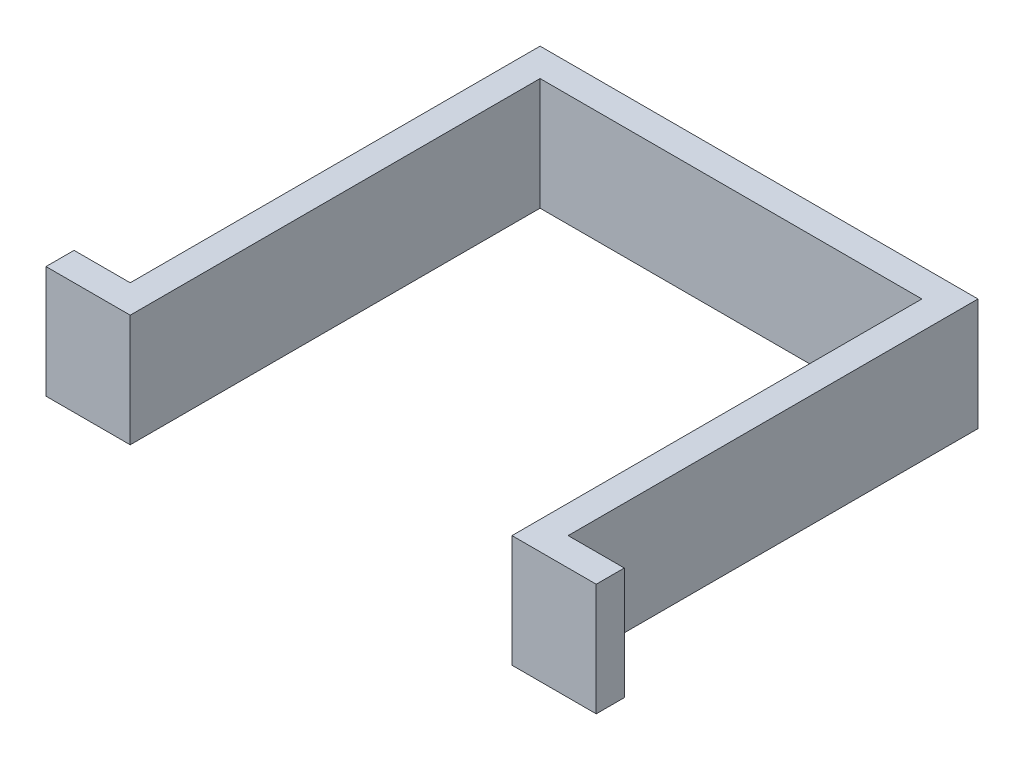
ISO-10303-21;
HEADER;
FILE_DESCRIPTION(('STEP AP214'),'2;1');
FILE_NAME('part.step','',(''),(''),'','','');
FILE_SCHEMA(('AUTOMOTIVE_DESIGN { 1 0 10303 214 1 1 1 1 }'));
ENDSEC;
DATA;
#1=APPLICATION_CONTEXT('core data for automotive mechanical design processes');
#2=APPLICATION_PROTOCOL_DEFINITION('international standard','automotive_design',2000,#1);
#3=PRODUCT_CONTEXT('',#1,'mechanical');
#4=PRODUCT('Part','Part','',(#3));
#5=PRODUCT_RELATED_PRODUCT_CATEGORY('part','',(#4));
#6=PRODUCT_DEFINITION_FORMATION('','',#4);
#7=PRODUCT_DEFINITION_CONTEXT('part definition',#1,'design');
#8=PRODUCT_DEFINITION('design','',#6,#7);
#9=PRODUCT_DEFINITION_SHAPE('','',#8);
#10=(LENGTH_UNIT() NAMED_UNIT(*) SI_UNIT(.MILLI.,.METRE.));
#11=(NAMED_UNIT(*) PLANE_ANGLE_UNIT() SI_UNIT($,.RADIAN.));
#12=(NAMED_UNIT(*) SI_UNIT($,.STERADIAN.) SOLID_ANGLE_UNIT());
#13=UNCERTAINTY_MEASURE_WITH_UNIT(LENGTH_MEASURE(1.E-05),#10,'distance_accuracy_value','');
#14=(GEOMETRIC_REPRESENTATION_CONTEXT(3) GLOBAL_UNCERTAINTY_ASSIGNED_CONTEXT((#13)) GLOBAL_UNIT_ASSIGNED_CONTEXT((#10,
#11,#12)) REPRESENTATION_CONTEXT('',''));
#15=CARTESIAN_POINT('',(0.,0.,0.));
#16=DIRECTION('',(0.,0.,1.));
#17=DIRECTION('',(1.,0.,0.));
#18=AXIS2_PLACEMENT_3D('',#15,#16,#17);
#19=CARTESIAN_POINT('',(-49.4642857142857,20.,-5.));
#20=DIRECTION('',(1.,0.,0.));
#21=DIRECTION('',(0.,0.,-1.));
#22=AXIS2_PLACEMENT_3D('',#19,#20,#21);
#23=PLANE('',#22);
#24=DIRECTION('',(0.,0.,1.));
#25=VECTOR('',#24,1.);
#26=CARTESIAN_POINT('',(-49.4642857142857,0.,-5.));
#27=LINE('',#26,#25);
#28=CARTESIAN_POINT('',(-49.4642857142857,0.,-5.));
#29=VERTEX_POINT('',#28);
#30=CARTESIAN_POINT('',(-49.4642857142857,0.,0.));
#31=VERTEX_POINT('',#30);
#32=EDGE_CURVE('E164',#29,#31,#27,.T.);
#33=ORIENTED_EDGE('',*,*,#32,.T.);
#34=DIRECTION('',(0.,-1.,0.));
#35=VECTOR('',#34,1.);
#36=CARTESIAN_POINT('',(-49.4642857142857,20.,0.));
#37=LINE('',#36,#35);
#38=CARTESIAN_POINT('',(-49.4642857142857,20.,0.));
#39=VERTEX_POINT('',#38);
#40=EDGE_CURVE('E11',#39,#31,#37,.T.);
#41=ORIENTED_EDGE('',*,*,#40,.F.);
#42=DIRECTION('',(0.,0.,1.));
#43=VECTOR('',#42,1.);
#44=CARTESIAN_POINT('',(-49.4642857142857,20.,-5.));
#45=LINE('',#44,#43);
#46=CARTESIAN_POINT('',(-49.4642857142857,20.,-5.));
#47=VERTEX_POINT('',#46);
#48=EDGE_CURVE('E198',#47,#39,#45,.T.);
#49=ORIENTED_EDGE('',*,*,#48,.F.);
#50=DIRECTION('',(0.,-1.,0.));
#51=VECTOR('',#50,1.);
#52=CARTESIAN_POINT('',(-49.4642857142857,20.,-5.));
#53=LINE('',#52,#51);
#54=EDGE_CURVE('E160',#47,#29,#53,.T.);
#55=ORIENTED_EDGE('',*,*,#54,.T.);
#56=EDGE_LOOP('',(#33,#41,#49,#55));
#57=FACE_BOUND('',#56,.T.);
#58=ADVANCED_FACE('F39',(#57),#23,.F.);
#59=CARTESIAN_POINT('',(-49.4642857142857,20.,0.));
#60=DIRECTION('',(0.,0.,-1.));
#61=DIRECTION('',(-1.,0.,0.));
#62=AXIS2_PLACEMENT_3D('',#59,#60,#61);
#63=PLANE('',#62);
#64=DIRECTION('',(1.,0.,0.));
#65=VECTOR('',#64,1.);
#66=CARTESIAN_POINT('',(-49.4642857142857,0.,0.));
#67=LINE('',#66,#65);
#68=CARTESIAN_POINT('',(-34.4642857142857,0.,0.));
#69=VERTEX_POINT('',#68);
#70=EDGE_CURVE('E168',#31,#69,#67,.T.);
#71=ORIENTED_EDGE('',*,*,#70,.T.);
#72=DIRECTION('',(0.,-1.,0.));
#73=VECTOR('',#72,1.);
#74=CARTESIAN_POINT('',(-34.4642857142857,20.,0.));
#75=LINE('',#74,#73);
#76=CARTESIAN_POINT('',(-34.4642857142857,20.,0.));
#77=VERTEX_POINT('',#76);
#78=EDGE_CURVE('E48',#77,#69,#75,.T.);
#79=ORIENTED_EDGE('',*,*,#78,.F.);
#80=DIRECTION('',(1.,0.,0.));
#81=VECTOR('',#80,1.);
#82=CARTESIAN_POINT('',(-49.4642857142857,20.,0.));
#83=LINE('',#82,#81);
#84=EDGE_CURVE('E111',#39,#77,#83,.T.);
#85=ORIENTED_EDGE('',*,*,#84,.F.);
#86=ORIENTED_EDGE('',*,*,#40,.T.);
#87=EDGE_LOOP('',(#71,#79,#85,#86));
#88=FACE_BOUND('',#87,.T.);
#89=ADVANCED_FACE('F292',(#88),#63,.F.);
#90=CARTESIAN_POINT('',(-34.4642857142857,20.,0.));
#91=DIRECTION('',(-1.,0.,0.));
#92=DIRECTION('',(0.,0.,1.));
#93=AXIS2_PLACEMENT_3D('',#90,#91,#92);
#94=PLANE('',#93);
#95=DIRECTION('',(0.,0.,-1.));
#96=VECTOR('',#95,1.);
#97=CARTESIAN_POINT('',(-34.4642857142857,0.,0.));
#98=LINE('',#97,#96);
#99=CARTESIAN_POINT('',(-34.4642857142857,0.,-73.));
#100=VERTEX_POINT('',#99);
#101=EDGE_CURVE('E171',#69,#100,#98,.T.);
#102=ORIENTED_EDGE('',*,*,#101,.T.);
#103=DIRECTION('',(0.,-1.,0.));
#104=VECTOR('',#103,1.);
#105=CARTESIAN_POINT('',(-34.4642857142857,20.,-73.));
#106=LINE('',#105,#104);
#107=CARTESIAN_POINT('',(-34.4642857142857,20.,-73.));
#108=VERTEX_POINT('',#107);
#109=EDGE_CURVE('E225',#108,#100,#106,.T.);
#110=ORIENTED_EDGE('',*,*,#109,.F.);
#111=DIRECTION('',(0.,0.,-1.));
#112=VECTOR('',#111,1.);
#113=CARTESIAN_POINT('',(-34.4642857142857,20.,0.));
#114=LINE('',#113,#112);
#115=EDGE_CURVE('E235',#77,#108,#114,.T.);
#116=ORIENTED_EDGE('',*,*,#115,.F.);
#117=ORIENTED_EDGE('',*,*,#78,.T.);
#118=EDGE_LOOP('',(#102,#110,#116,#117));
#119=FACE_BOUND('',#118,.T.);
#120=ADVANCED_FACE('F233',(#119),#94,.F.);
#121=CARTESIAN_POINT('',(-34.4642857142857,20.,-73.));
#122=DIRECTION('',(0.,0.,-1.));
#123=DIRECTION('',(-1.,0.,0.));
#124=AXIS2_PLACEMENT_3D('',#121,#122,#123);
#125=PLANE('',#124);
#126=DIRECTION('',(1.,0.,0.));
#127=VECTOR('',#126,1.);
#128=CARTESIAN_POINT('',(-34.4642857142857,0.,-73.));
#129=LINE('',#128,#127);
#130=CARTESIAN_POINT('',(33.5357142857143,0.,-73.));
#131=VERTEX_POINT('',#130);
#132=EDGE_CURVE('E174',#100,#131,#129,.T.);
#133=ORIENTED_EDGE('',*,*,#132,.T.);
#134=DIRECTION('',(0.,-1.,0.));
#135=VECTOR('',#134,1.);
#136=CARTESIAN_POINT('',(33.5357142857143,20.,-73.));
#137=LINE('',#136,#135);
#138=CARTESIAN_POINT('',(33.5357142857143,20.,-73.));
#139=VERTEX_POINT('',#138);
#140=EDGE_CURVE('E221',#139,#131,#137,.T.);
#141=ORIENTED_EDGE('',*,*,#140,.F.);
#142=DIRECTION('',(1.,0.,0.));
#143=VECTOR('',#142,1.);
#144=CARTESIAN_POINT('',(-34.4642857142857,20.,-73.));
#145=LINE('',#144,#143);
#146=EDGE_CURVE('E254',#108,#139,#145,.T.);
#147=ORIENTED_EDGE('',*,*,#146,.F.);
#148=ORIENTED_EDGE('',*,*,#109,.T.);
#149=EDGE_LOOP('',(#133,#141,#147,#148));
#150=FACE_BOUND('',#149,.T.);
#151=ADVANCED_FACE('F244',(#150),#125,.F.);
#152=CARTESIAN_POINT('',(33.5357142857143,20.,-73.));
#153=DIRECTION('',(1.,0.,0.));
#154=DIRECTION('',(0.,0.,-1.));
#155=AXIS2_PLACEMENT_3D('',#152,#153,#154);
#156=PLANE('',#155);
#157=DIRECTION('',(0.,0.,1.));
#158=VECTOR('',#157,1.);
#159=CARTESIAN_POINT('',(33.5357142857143,0.,-73.));
#160=LINE('',#159,#158);
#161=CARTESIAN_POINT('',(33.5357142857143,0.,0.));
#162=VERTEX_POINT('',#161);
#163=EDGE_CURVE('E177',#131,#162,#160,.T.);
#164=ORIENTED_EDGE('',*,*,#163,.T.);
#165=DIRECTION('',(0.,-1.,0.));
#166=VECTOR('',#165,1.);
#167=CARTESIAN_POINT('',(33.5357142857143,20.,0.));
#168=LINE('',#167,#166);
#169=CARTESIAN_POINT('',(33.5357142857143,20.,0.));
#170=VERTEX_POINT('',#169);
#171=EDGE_CURVE('E217',#170,#162,#168,.T.);
#172=ORIENTED_EDGE('',*,*,#171,.F.);
#173=DIRECTION('',(0.,0.,1.));
#174=VECTOR('',#173,1.);
#175=CARTESIAN_POINT('',(33.5357142857143,20.,-73.));
#176=LINE('',#175,#174);
#177=EDGE_CURVE('E250',#139,#170,#176,.T.);
#178=ORIENTED_EDGE('',*,*,#177,.F.);
#179=ORIENTED_EDGE('',*,*,#140,.T.);
#180=EDGE_LOOP('',(#164,#172,#178,#179));
#181=FACE_BOUND('',#180,.T.);
#182=ADVANCED_FACE('F248',(#181),#156,.F.);
#183=CARTESIAN_POINT('',(33.5357142857143,20.,0.));
#184=DIRECTION('',(0.,0.,-1.));
#185=DIRECTION('',(-1.,0.,0.));
#186=AXIS2_PLACEMENT_3D('',#183,#184,#185);
#187=PLANE('',#186);
#188=DIRECTION('',(1.,0.,0.));
#189=VECTOR('',#188,1.);
#190=CARTESIAN_POINT('',(33.5357142857143,0.,0.));
#191=LINE('',#190,#189);
#192=CARTESIAN_POINT('',(48.5357142857143,0.,0.));
#193=VERTEX_POINT('',#192);
#194=EDGE_CURVE('E180',#162,#193,#191,.T.);
#195=ORIENTED_EDGE('',*,*,#194,.T.);
#196=DIRECTION('',(0.,-1.,0.));
#197=VECTOR('',#196,1.);
#198=CARTESIAN_POINT('',(48.5357142857143,20.,0.));
#199=LINE('',#198,#197);
#200=CARTESIAN_POINT('',(48.5357142857143,20.,0.));
#201=VERTEX_POINT('',#200);
#202=EDGE_CURVE('E213',#201,#193,#199,.T.);
#203=ORIENTED_EDGE('',*,*,#202,.F.);
#204=DIRECTION('',(1.,0.,0.));
#205=VECTOR('',#204,1.);
#206=CARTESIAN_POINT('',(33.5357142857143,20.,0.));
#207=LINE('',#206,#205);
#208=EDGE_CURVE('E253',#170,#201,#207,.T.);
#209=ORIENTED_EDGE('',*,*,#208,.F.);
#210=ORIENTED_EDGE('',*,*,#171,.T.);
#211=EDGE_LOOP('',(#195,#203,#209,#210));
#212=FACE_BOUND('',#211,.T.);
#213=ADVANCED_FACE('F305',(#212),#187,.F.);
#214=CARTESIAN_POINT('',(48.5357142857143,20.,0.));
#215=DIRECTION('',(-1.,0.,0.));
#216=DIRECTION('',(0.,0.,1.));
#217=AXIS2_PLACEMENT_3D('',#214,#215,#216);
#218=PLANE('',#217);
#219=DIRECTION('',(0.,0.,-1.));
#220=VECTOR('',#219,1.);
#221=CARTESIAN_POINT('',(48.5357142857143,0.,0.));
#222=LINE('',#221,#220);
#223=CARTESIAN_POINT('',(48.5357142857143,0.,-5.));
#224=VERTEX_POINT('',#223);
#225=EDGE_CURVE('E183',#193,#224,#222,.T.);
#226=ORIENTED_EDGE('',*,*,#225,.T.);
#227=DIRECTION('',(0.,-1.,0.));
#228=VECTOR('',#227,1.);
#229=CARTESIAN_POINT('',(48.5357142857143,20.,-5.));
#230=LINE('',#229,#228);
#231=CARTESIAN_POINT('',(48.5357142857143,20.,-5.));
#232=VERTEX_POINT('',#231);
#233=EDGE_CURVE('E209',#232,#224,#230,.T.);
#234=ORIENTED_EDGE('',*,*,#233,.F.);
#235=DIRECTION('',(0.,0.,-1.));
#236=VECTOR('',#235,1.);
#237=CARTESIAN_POINT('',(48.5357142857143,20.,0.));
#238=LINE('',#237,#236);
#239=EDGE_CURVE('E258',#201,#232,#238,.T.);
#240=ORIENTED_EDGE('',*,*,#239,.F.);
#241=ORIENTED_EDGE('',*,*,#202,.T.);
#242=EDGE_LOOP('',(#226,#234,#240,#241));
#243=FACE_BOUND('',#242,.T.);
#244=ADVANCED_FACE('F308',(#243),#218,.F.);
#245=CARTESIAN_POINT('',(48.5357142857143,20.,-5.));
#246=DIRECTION('',(0.,0.,1.));
#247=DIRECTION('',(1.,0.,0.));
#248=AXIS2_PLACEMENT_3D('',#245,#246,#247);
#249=PLANE('',#248);
#250=DIRECTION('',(-1.,0.,0.));
#251=VECTOR('',#250,1.);
#252=CARTESIAN_POINT('',(48.5357142857143,0.,-5.));
#253=LINE('',#252,#251);
#254=CARTESIAN_POINT('',(38.5357142857143,0.,-5.));
#255=VERTEX_POINT('',#254);
#256=EDGE_CURVE('E186',#224,#255,#253,.T.);
#257=ORIENTED_EDGE('',*,*,#256,.T.);
#258=DIRECTION('',(0.,-1.,0.));
#259=VECTOR('',#258,1.);
#260=CARTESIAN_POINT('',(38.5357142857143,20.,-5.));
#261=LINE('',#260,#259);
#262=CARTESIAN_POINT('',(38.5357142857143,20.,-5.));
#263=VERTEX_POINT('',#262);
#264=EDGE_CURVE('E205',#263,#255,#261,.T.);
#265=ORIENTED_EDGE('',*,*,#264,.F.);
#266=DIRECTION('',(-1.,0.,0.));
#267=VECTOR('',#266,1.);
#268=CARTESIAN_POINT('',(48.5357142857143,20.,-5.));
#269=LINE('',#268,#267);
#270=EDGE_CURVE('E265',#232,#263,#269,.T.);
#271=ORIENTED_EDGE('',*,*,#270,.F.);
#272=ORIENTED_EDGE('',*,*,#233,.T.);
#273=EDGE_LOOP('',(#257,#265,#271,#272));
#274=FACE_BOUND('',#273,.T.);
#275=ADVANCED_FACE('F273',(#274),#249,.F.);
#276=CARTESIAN_POINT('',(38.5357142857143,20.,-5.));
#277=DIRECTION('',(-1.,0.,0.));
#278=DIRECTION('',(0.,0.,1.));
#279=AXIS2_PLACEMENT_3D('',#276,#277,#278);
#280=PLANE('',#279);
#281=DIRECTION('',(0.,0.,-1.));
#282=VECTOR('',#281,1.);
#283=CARTESIAN_POINT('',(38.5357142857143,0.,-5.));
#284=LINE('',#283,#282);
#285=CARTESIAN_POINT('',(38.5357142857143,0.,-78.));
#286=VERTEX_POINT('',#285);
#287=EDGE_CURVE('E189',#255,#286,#284,.T.);
#288=ORIENTED_EDGE('',*,*,#287,.T.);
#289=DIRECTION('',(0.,-1.,0.));
#290=VECTOR('',#289,1.);
#291=CARTESIAN_POINT('',(38.5357142857143,20.,-78.));
#292=LINE('',#291,#290);
#293=CARTESIAN_POINT('',(38.5357142857143,20.,-78.));
#294=VERTEX_POINT('',#293);
#295=EDGE_CURVE('E153',#294,#286,#292,.T.);
#296=ORIENTED_EDGE('',*,*,#295,.F.);
#297=DIRECTION('',(0.,0.,-1.));
#298=VECTOR('',#297,1.);
#299=CARTESIAN_POINT('',(38.5357142857143,20.,-5.));
#300=LINE('',#299,#298);
#301=EDGE_CURVE('E142',#263,#294,#300,.T.);
#302=ORIENTED_EDGE('',*,*,#301,.F.);
#303=ORIENTED_EDGE('',*,*,#264,.T.);
#304=EDGE_LOOP('',(#288,#296,#302,#303));
#305=FACE_BOUND('',#304,.T.);
#306=ADVANCED_FACE('F277',(#305),#280,.F.);
#307=CARTESIAN_POINT('',(38.5357142857143,20.,-78.));
#308=DIRECTION('',(0.,0.,1.));
#309=DIRECTION('',(1.,0.,0.));
#310=AXIS2_PLACEMENT_3D('',#307,#308,#309);
#311=PLANE('',#310);
#312=DIRECTION('',(-1.,0.,0.));
#313=VECTOR('',#312,1.);
#314=CARTESIAN_POINT('',(38.5357142857143,0.,-78.));
#315=LINE('',#314,#313);
#316=CARTESIAN_POINT('',(-39.4642857142857,0.,-78.));
#317=VERTEX_POINT('',#316);
#318=EDGE_CURVE('E151',#286,#317,#315,.T.);
#319=ORIENTED_EDGE('',*,*,#318,.T.);
#320=DIRECTION('',(0.,-1.,0.));
#321=VECTOR('',#320,1.);
#322=CARTESIAN_POINT('',(-39.4642857142857,20.,-78.));
#323=LINE('',#322,#321);
#324=CARTESIAN_POINT('',(-39.4642857142857,20.,-78.));
#325=VERTEX_POINT('',#324);
#326=EDGE_CURVE('E148',#325,#317,#323,.T.);
#327=ORIENTED_EDGE('',*,*,#326,.F.);
#328=DIRECTION('',(-1.,0.,0.));
#329=VECTOR('',#328,1.);
#330=CARTESIAN_POINT('',(38.5357142857143,20.,-78.));
#331=LINE('',#330,#329);
#332=EDGE_CURVE('E136',#294,#325,#331,.T.);
#333=ORIENTED_EDGE('',*,*,#332,.F.);
#334=ORIENTED_EDGE('',*,*,#295,.T.);
#335=EDGE_LOOP('',(#319,#327,#333,#334));
#336=FACE_BOUND('',#335,.T.);
#337=ADVANCED_FACE('F149',(#336),#311,.F.);
#338=CARTESIAN_POINT('',(-39.4642857142857,20.,-78.));
#339=DIRECTION('',(1.,0.,0.));
#340=DIRECTION('',(0.,0.,-1.));
#341=AXIS2_PLACEMENT_3D('',#338,#339,#340);
#342=PLANE('',#341);
#343=DIRECTION('',(0.,0.,1.));
#344=VECTOR('',#343,1.);
#345=CARTESIAN_POINT('',(-39.4642857142857,0.,-78.));
#346=LINE('',#345,#344);
#347=CARTESIAN_POINT('',(-39.4642857142857,0.,-5.));
#348=VERTEX_POINT('',#347);
#349=EDGE_CURVE('E97',#317,#348,#346,.T.);
#350=ORIENTED_EDGE('',*,*,#349,.T.);
#351=DIRECTION('',(0.,-1.,0.));
#352=VECTOR('',#351,1.);
#353=CARTESIAN_POINT('',(-39.4642857142857,20.,-5.));
#354=LINE('',#353,#352);
#355=CARTESIAN_POINT('',(-39.4642857142857,20.,-5.));
#356=VERTEX_POINT('',#355);
#357=EDGE_CURVE('E154',#356,#348,#354,.T.);
#358=ORIENTED_EDGE('',*,*,#357,.F.);
#359=DIRECTION('',(0.,0.,1.));
#360=VECTOR('',#359,1.);
#361=CARTESIAN_POINT('',(-39.4642857142857,20.,-78.));
#362=LINE('',#361,#360);
#363=EDGE_CURVE('E140',#325,#356,#362,.T.);
#364=ORIENTED_EDGE('',*,*,#363,.F.);
#365=ORIENTED_EDGE('',*,*,#326,.T.);
#366=EDGE_LOOP('',(#350,#358,#364,#365));
#367=FACE_BOUND('',#366,.T.);
#368=ADVANCED_FACE('F156',(#367),#342,.F.);
#369=CARTESIAN_POINT('',(-39.4642857142857,20.,-5.));
#370=DIRECTION('',(0.,0.,1.));
#371=DIRECTION('',(1.,0.,0.));
#372=AXIS2_PLACEMENT_3D('',#369,#370,#371);
#373=PLANE('',#372);
#374=DIRECTION('',(-1.,0.,0.));
#375=VECTOR('',#374,1.);
#376=CARTESIAN_POINT('',(-39.4642857142857,0.,-5.));
#377=LINE('',#376,#375);
#378=EDGE_CURVE('E103',#348,#29,#377,.T.);
#379=ORIENTED_EDGE('',*,*,#378,.T.);
#380=ORIENTED_EDGE('',*,*,#54,.F.);
#381=DIRECTION('',(-1.,0.,0.));
#382=VECTOR('',#381,1.);
#383=CARTESIAN_POINT('',(-39.4642857142857,20.,-5.));
#384=LINE('',#383,#382);
#385=EDGE_CURVE('E56',#356,#47,#384,.T.);
#386=ORIENTED_EDGE('',*,*,#385,.F.);
#387=ORIENTED_EDGE('',*,*,#357,.T.);
#388=EDGE_LOOP('',(#379,#380,#386,#387));
#389=FACE_BOUND('',#388,.T.);
#390=ADVANCED_FACE('F281',(#389),#373,.F.);
#391=CARTESIAN_POINT('',(0.,20.,0.));
#392=DIRECTION('',(0.,1.,0.));
#393=DIRECTION('',(0.,0.,1.));
#394=AXIS2_PLACEMENT_3D('',#391,#392,#393);
#395=PLANE('',#394);
#396=ORIENTED_EDGE('',*,*,#48,.T.);
#397=ORIENTED_EDGE('',*,*,#84,.T.);
#398=ORIENTED_EDGE('',*,*,#115,.T.);
#399=ORIENTED_EDGE('',*,*,#146,.T.);
#400=ORIENTED_EDGE('',*,*,#177,.T.);
#401=ORIENTED_EDGE('',*,*,#208,.T.);
#402=ORIENTED_EDGE('',*,*,#239,.T.);
#403=ORIENTED_EDGE('',*,*,#270,.T.);
#404=ORIENTED_EDGE('',*,*,#301,.T.);
#405=ORIENTED_EDGE('',*,*,#332,.T.);
#406=ORIENTED_EDGE('',*,*,#363,.T.);
#407=ORIENTED_EDGE('',*,*,#385,.T.);
#408=EDGE_LOOP('',(#396,#397,#398,#399,#400,#401,#402,#403,#404,#405,#406,#407));
#409=FACE_BOUND('',#408,.T.);
#410=ADVANCED_FACE('F138',(#409),#395,.T.);
#411=CARTESIAN_POINT('',(0.,0.,0.));
#412=DIRECTION('',(0.,1.,0.));
#413=DIRECTION('',(0.,0.,1.));
#414=AXIS2_PLACEMENT_3D('',#411,#412,#413);
#415=PLANE('',#414);
#416=ORIENTED_EDGE('',*,*,#32,.F.);
#417=ORIENTED_EDGE('',*,*,#378,.F.);
#418=ORIENTED_EDGE('',*,*,#349,.F.);
#419=ORIENTED_EDGE('',*,*,#318,.F.);
#420=ORIENTED_EDGE('',*,*,#287,.F.);
#421=ORIENTED_EDGE('',*,*,#256,.F.);
#422=ORIENTED_EDGE('',*,*,#225,.F.);
#423=ORIENTED_EDGE('',*,*,#194,.F.);
#424=ORIENTED_EDGE('',*,*,#163,.F.);
#425=ORIENTED_EDGE('',*,*,#132,.F.);
#426=ORIENTED_EDGE('',*,*,#101,.F.);
#427=ORIENTED_EDGE('',*,*,#70,.F.);
#428=EDGE_LOOP('',(#416,#417,#418,#419,#420,#421,#422,#423,#424,#425,#426,#427));
#429=FACE_BOUND('',#428,.T.);
#430=ADVANCED_FACE('F239',(#429),#415,.F.);
#431=CLOSED_SHELL('',(#58,#89,#120,#151,#182,#213,#244,#275,#306,#337,#368,#390,#410,#430));
#432=MANIFOLD_SOLID_BREP('B2',#431);
#433=ADVANCED_BREP_SHAPE_REPRESENTATION('',(#18,#432),#14);
#434=SHAPE_DEFINITION_REPRESENTATION(#9,#433);
ENDSEC;
END-ISO-10303-21;
